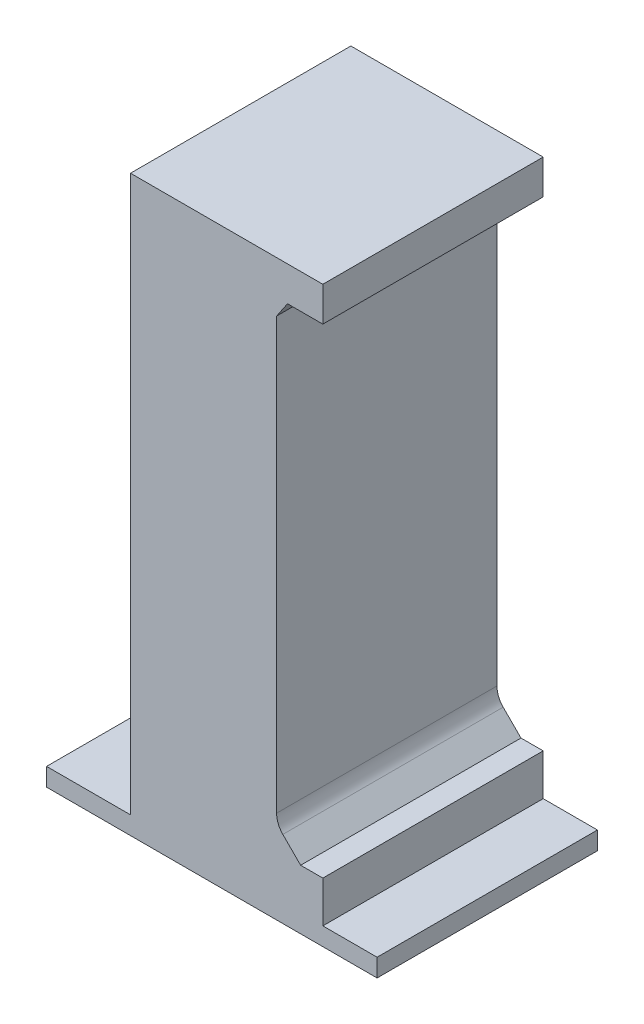
ISO-10303-21;
HEADER;
FILE_DESCRIPTION(('STEP AP214'),'2;1');
FILE_NAME('part.step','',(''),(''),'','','');
FILE_SCHEMA(('AUTOMOTIVE_DESIGN { 1 0 10303 214 1 1 1 1 }'));
ENDSEC;
DATA;
#1=APPLICATION_CONTEXT('core data for automotive mechanical design processes');
#2=APPLICATION_PROTOCOL_DEFINITION('international standard','automotive_design',2000,#1);
#3=PRODUCT_CONTEXT('',#1,'mechanical');
#4=PRODUCT('Part','Part','',(#3));
#5=PRODUCT_RELATED_PRODUCT_CATEGORY('part','',(#4));
#6=PRODUCT_DEFINITION_FORMATION('','',#4);
#7=PRODUCT_DEFINITION_CONTEXT('part definition',#1,'design');
#8=PRODUCT_DEFINITION('design','',#6,#7);
#9=PRODUCT_DEFINITION_SHAPE('','',#8);
#10=(LENGTH_UNIT() NAMED_UNIT(*) SI_UNIT(.MILLI.,.METRE.));
#11=(NAMED_UNIT(*) PLANE_ANGLE_UNIT() SI_UNIT($,.RADIAN.));
#12=(NAMED_UNIT(*) SI_UNIT($,.STERADIAN.) SOLID_ANGLE_UNIT());
#13=UNCERTAINTY_MEASURE_WITH_UNIT(LENGTH_MEASURE(1.E-05),#10,'distance_accuracy_value','');
#14=(GEOMETRIC_REPRESENTATION_CONTEXT(3) GLOBAL_UNCERTAINTY_ASSIGNED_CONTEXT((#13)) GLOBAL_UNIT_ASSIGNED_CONTEXT((#10,
#11,#12)) REPRESENTATION_CONTEXT('',''));
#15=CARTESIAN_POINT('',(0.,0.,0.));
#16=DIRECTION('',(0.,0.,1.));
#17=DIRECTION('',(1.,0.,0.));
#18=AXIS2_PLACEMENT_3D('',#15,#16,#17);
#19=CARTESIAN_POINT('',(355.677673608527,355.677673608536,500.));
#20=DIRECTION('',(-0.707106781186538,-0.707106781186557,0.));
#21=DIRECTION('',(0.707106781186557,-0.707106781186538,0.));
#22=AXIS2_PLACEMENT_3D('',#19,#20,#21);
#23=PLANE('',#22);
#24=DIRECTION('',(-0.707106781186557,0.707106781186538,0.));
#25=VECTOR('',#24,1.);
#26=CARTESIAN_POINT('',(355.677673608527,355.677673608536,0.));
#27=LINE('',#26,#25);
#28=CARTESIAN_POINT('',(576.527963911067,134.827383306002,0.));
#29=VERTEX_POINT('',#28);
#30=CARTESIAN_POINT('',(536.098133640697,175.257213576372,0.));
#31=VERTEX_POINT('',#30);
#32=EDGE_CURVE('E127',#29,#31,#27,.T.);
#33=ORIENTED_EDGE('',*,*,#32,.T.);
#34=DIRECTION('',(0.,0.,-1.));
#35=VECTOR('',#34,1.);
#36=CARTESIAN_POINT('',(536.098133640697,175.257213576372,500.));
#37=LINE('',#36,#35);
#38=CARTESIAN_POINT('',(536.098133640697,175.257213576372,500.));
#39=VERTEX_POINT('',#38);
#40=EDGE_CURVE('E11',#39,#31,#37,.T.);
#41=ORIENTED_EDGE('',*,*,#40,.F.);
#42=DIRECTION('',(-0.707106781186557,0.707106781186538,0.));
#43=VECTOR('',#42,1.);
#44=CARTESIAN_POINT('',(355.677673608527,355.677673608536,500.));
#45=LINE('',#44,#43);
#46=CARTESIAN_POINT('',(576.527963911067,134.827383306002,500.));
#47=VERTEX_POINT('',#46);
#48=EDGE_CURVE('E193',#47,#39,#45,.T.);
#49=ORIENTED_EDGE('',*,*,#48,.F.);
#50=DIRECTION('',(0.,0.,-1.));
#51=VECTOR('',#50,1.);
#52=CARTESIAN_POINT('',(576.527963911067,134.827383306002,500.));
#53=LINE('',#52,#51);
#54=EDGE_CURVE('E273',#47,#29,#53,.T.);
#55=ORIENTED_EDGE('',*,*,#54,.T.);
#56=EDGE_LOOP('',(#33,#41,#49,#55));
#57=FACE_BOUND('',#56,.T.);
#58=ADVANCED_FACE('F35',(#57),#23,.F.);
#59=CARTESIAN_POINT('',(569.887129556303,209.046209491978,500.));
#60=DIRECTION('',(0.,0.,-1.));
#61=DIRECTION('',(-1.,0.,0.));
#62=AXIS2_PLACEMENT_3D('',#59,#60,#61);
#63=CYLINDRICAL_SURFACE('',#62,47.7848562828196);
#64=CARTESIAN_POINT('',(569.887129556303,209.046209491978,0.));
#65=DIRECTION('',(0.,0.,1.));
#66=DIRECTION('',(1.,0.,0.));
#67=AXIS2_PLACEMENT_3D('',#64,#65,#66);
#68=CIRCLE('',#67,47.7848562828196);
#69=CARTESIAN_POINT('',(522.112187732539,210.019566418123,0.));
#70=VERTEX_POINT('',#69);
#71=EDGE_CURVE('E276',#31,#70,#68,.F.);
#72=ORIENTED_EDGE('',*,*,#71,.T.);
#73=DIRECTION('',(0.,0.,-1.));
#74=VECTOR('',#73,1.);
#75=CARTESIAN_POINT('',(522.112187732539,210.019566418123,500.));
#76=LINE('',#75,#74);
#77=CARTESIAN_POINT('',(522.112187732539,210.019566418123,500.));
#78=VERTEX_POINT('',#77);
#79=EDGE_CURVE('E45',#78,#70,#76,.T.);
#80=ORIENTED_EDGE('',*,*,#79,.F.);
#81=CARTESIAN_POINT('',(569.887129556303,209.046209491978,500.));
#82=DIRECTION('',(0.,0.,1.));
#83=DIRECTION('',(1.,0.,0.));
#84=AXIS2_PLACEMENT_3D('',#81,#82,#83);
#85=CIRCLE('',#84,47.7848562828196);
#86=EDGE_CURVE('E313',#39,#78,#85,.F.);
#87=ORIENTED_EDGE('',*,*,#86,.F.);
#88=ORIENTED_EDGE('',*,*,#40,.T.);
#89=EDGE_LOOP('',(#72,#80,#87,#88));
#90=FACE_BOUND('',#89,.T.);
#91=ADVANCED_FACE('F314',(#90),#63,.F.);
#92=CARTESIAN_POINT('',(522.112187732539,0.,500.));
#93=DIRECTION('',(1.,0.,0.));
#94=DIRECTION('',(0.,0.,-1.));
#95=AXIS2_PLACEMENT_3D('',#92,#93,#94);
#96=PLANE('',#95);
#97=DIRECTION('',(0.,-1.,0.));
#98=VECTOR('',#97,1.);
#99=CARTESIAN_POINT('',(522.112187732539,0.,0.));
#100=LINE('',#99,#98);
#101=CARTESIAN_POINT('',(522.112187732539,1186.98841645926,0.));
#102=VERTEX_POINT('',#101);
#103=EDGE_CURVE('E279',#102,#70,#100,.T.);
#104=ORIENTED_EDGE('',*,*,#103,.F.);
#105=DIRECTION('',(0.,0.,-1.));
#106=VECTOR('',#105,1.);
#107=CARTESIAN_POINT('',(522.112187732539,1186.98841645926,500.));
#108=LINE('',#107,#106);
#109=CARTESIAN_POINT('',(522.112187732539,1186.98841645926,500.));
#110=VERTEX_POINT('',#109);
#111=EDGE_CURVE('E342',#110,#102,#108,.T.);
#112=ORIENTED_EDGE('',*,*,#111,.F.);
#113=DIRECTION('',(0.,-1.,0.));
#114=VECTOR('',#113,1.);
#115=CARTESIAN_POINT('',(522.112187732539,0.,500.));
#116=LINE('',#115,#114);
#117=EDGE_CURVE('E317',#110,#78,#116,.T.);
#118=ORIENTED_EDGE('',*,*,#117,.T.);
#119=ORIENTED_EDGE('',*,*,#79,.T.);
#120=EDGE_LOOP('',(#104,#112,#118,#119));
#121=FACE_BOUND('',#120,.T.);
#122=ADVANCED_FACE('F345',(#121),#96,.T.);
#123=CARTESIAN_POINT('',(-192.457302623519,130.12474597394,500.));
#124=DIRECTION('',(0.828417150314277,-0.560111618398666,0.));
#125=DIRECTION('',(0.560111618398666,0.828417150314277,0.));
#126=AXIS2_PLACEMENT_3D('',#123,#124,#125);
#127=PLANE('',#126);
#128=DIRECTION('',(-0.560111618398666,-0.828417150314277,0.));
#129=VECTOR('',#128,1.);
#130=CARTESIAN_POINT('',(-192.457302623519,130.12474597394,0.));
#131=LINE('',#130,#129);
#132=CARTESIAN_POINT('',(546.743530070241,1223.41870241932,0.));
#133=VERTEX_POINT('',#132);
#134=EDGE_CURVE('E282',#133,#102,#131,.T.);
#135=ORIENTED_EDGE('',*,*,#134,.F.);
#136=DIRECTION('',(0.,0.,-1.));
#137=VECTOR('',#136,1.);
#138=CARTESIAN_POINT('',(546.743530070241,1223.41870241932,500.));
#139=LINE('',#138,#137);
#140=CARTESIAN_POINT('',(546.743530070241,1223.41870241932,500.));
#141=VERTEX_POINT('',#140);
#142=EDGE_CURVE('E329',#141,#133,#139,.T.);
#143=ORIENTED_EDGE('',*,*,#142,.F.);
#144=DIRECTION('',(-0.560111618398666,-0.828417150314277,0.));
#145=VECTOR('',#144,1.);
#146=CARTESIAN_POINT('',(-192.457302623519,130.12474597394,500.));
#147=LINE('',#146,#145);
#148=EDGE_CURVE('E319',#141,#110,#147,.T.);
#149=ORIENTED_EDGE('',*,*,#148,.T.);
#150=ORIENTED_EDGE('',*,*,#111,.T.);
#151=EDGE_LOOP('',(#135,#143,#149,#150));
#152=FACE_BOUND('',#151,.T.);
#153=ADVANCED_FACE('F347',(#152),#127,.T.);
#154=CARTESIAN_POINT('',(0.,1223.41870241932,500.));
#155=DIRECTION('',(0.,-1.,0.));
#156=DIRECTION('',(0.,0.,-1.));
#157=AXIS2_PLACEMENT_3D('',#154,#155,#156);
#158=PLANE('',#157);
#159=DIRECTION('',(-1.,0.,0.));
#160=VECTOR('',#159,1.);
#161=CARTESIAN_POINT('',(0.,1223.41870241932,0.));
#162=LINE('',#161,#160);
#163=CARTESIAN_POINT('',(626.898052251998,1223.41870241932,0.));
#164=VERTEX_POINT('',#163);
#165=EDGE_CURVE('E285',#164,#133,#162,.T.);
#166=ORIENTED_EDGE('',*,*,#165,.F.);
#167=DIRECTION('',(0.,0.,-1.));
#168=VECTOR('',#167,1.);
#169=CARTESIAN_POINT('',(626.898052251998,1223.41870241932,500.));
#170=LINE('',#169,#168);
#171=CARTESIAN_POINT('',(626.898052251998,1223.41870241932,500.));
#172=VERTEX_POINT('',#171);
#173=EDGE_CURVE('E331',#172,#164,#170,.T.);
#174=ORIENTED_EDGE('',*,*,#173,.F.);
#175=DIRECTION('',(-1.,0.,0.));
#176=VECTOR('',#175,1.);
#177=CARTESIAN_POINT('',(0.,1223.41870241932,500.));
#178=LINE('',#177,#176);
#179=EDGE_CURVE('E268',#172,#141,#178,.T.);
#180=ORIENTED_EDGE('',*,*,#179,.T.);
#181=ORIENTED_EDGE('',*,*,#142,.T.);
#182=EDGE_LOOP('',(#166,#174,#180,#181));
#183=FACE_BOUND('',#182,.T.);
#184=ADVANCED_FACE('F328',(#183),#158,.T.);
#185=CARTESIAN_POINT('',(626.898052251998,0.,500.));
#186=DIRECTION('',(1.,0.,0.));
#187=DIRECTION('',(0.,0.,-1.));
#188=AXIS2_PLACEMENT_3D('',#185,#186,#187);
#189=PLANE('',#188);
#190=DIRECTION('',(0.,-1.,0.));
#191=VECTOR('',#190,1.);
#192=CARTESIAN_POINT('',(626.898052251998,0.,0.));
#193=LINE('',#192,#191);
#194=CARTESIAN_POINT('',(626.898052251998,1301.77405160966,0.));
#195=VERTEX_POINT('',#194);
#196=EDGE_CURVE('E288',#195,#164,#193,.T.);
#197=ORIENTED_EDGE('',*,*,#196,.F.);
#198=DIRECTION('',(0.,0.,-1.));
#199=VECTOR('',#198,1.);
#200=CARTESIAN_POINT('',(626.898052251998,1301.77405160966,500.));
#201=LINE('',#200,#199);
#202=CARTESIAN_POINT('',(626.898052251998,1301.77405160966,500.));
#203=VERTEX_POINT('',#202);
#204=EDGE_CURVE('E337',#203,#195,#201,.T.);
#205=ORIENTED_EDGE('',*,*,#204,.F.);
#206=DIRECTION('',(0.,-1.,0.));
#207=VECTOR('',#206,1.);
#208=CARTESIAN_POINT('',(626.898052251998,0.,500.));
#209=LINE('',#208,#207);
#210=EDGE_CURVE('E261',#203,#172,#209,.T.);
#211=ORIENTED_EDGE('',*,*,#210,.T.);
#212=ORIENTED_EDGE('',*,*,#173,.T.);
#213=EDGE_LOOP('',(#197,#205,#211,#212));
#214=FACE_BOUND('',#213,.T.);
#215=ADVANCED_FACE('F336',(#214),#189,.T.);
#216=CARTESIAN_POINT('',(0.,1301.77405160966,500.));
#217=DIRECTION('',(0.,1.,0.));
#218=DIRECTION('',(0.,0.,1.));
#219=AXIS2_PLACEMENT_3D('',#216,#217,#218);
#220=PLANE('',#219);
#221=DIRECTION('',(1.,0.,0.));
#222=VECTOR('',#221,1.);
#223=CARTESIAN_POINT('',(0.,1301.77405160966,0.));
#224=LINE('',#223,#222);
#225=CARTESIAN_POINT('',(190.474219633678,1301.77405160966,0.));
#226=VERTEX_POINT('',#225);
#227=EDGE_CURVE('E233',#226,#195,#224,.T.);
#228=ORIENTED_EDGE('',*,*,#227,.F.);
#229=DIRECTION('',(0.,0.,-1.));
#230=VECTOR('',#229,1.);
#231=CARTESIAN_POINT('',(190.474219633678,1301.77405160966,500.));
#232=LINE('',#231,#230);
#233=CARTESIAN_POINT('',(190.474219633678,1301.77405160966,500.));
#234=VERTEX_POINT('',#233);
#235=EDGE_CURVE('E251',#234,#226,#232,.T.);
#236=ORIENTED_EDGE('',*,*,#235,.F.);
#237=DIRECTION('',(1.,0.,0.));
#238=VECTOR('',#237,1.);
#239=CARTESIAN_POINT('',(0.,1301.77405160966,500.));
#240=LINE('',#239,#238);
#241=EDGE_CURVE('E256',#234,#203,#240,.T.);
#242=ORIENTED_EDGE('',*,*,#241,.T.);
#243=ORIENTED_EDGE('',*,*,#204,.T.);
#244=EDGE_LOOP('',(#228,#236,#242,#243));
#245=FACE_BOUND('',#244,.T.);
#246=ADVANCED_FACE('F389',(#245),#220,.T.);
#247=CARTESIAN_POINT('',(190.474219633678,0.,500.));
#248=DIRECTION('',(-1.,0.,0.));
#249=DIRECTION('',(0.,0.,1.));
#250=AXIS2_PLACEMENT_3D('',#247,#248,#249);
#251=PLANE('',#250);
#252=DIRECTION('',(0.,1.,0.));
#253=VECTOR('',#252,1.);
#254=CARTESIAN_POINT('',(190.474219633678,0.,0.));
#255=LINE('',#254,#253);
#256=CARTESIAN_POINT('',(190.474219633678,40.878221652433,0.));
#257=VERTEX_POINT('',#256);
#258=EDGE_CURVE('E231',#257,#226,#255,.T.);
#259=ORIENTED_EDGE('',*,*,#258,.F.);
#260=DIRECTION('',(0.,0.,-1.));
#261=VECTOR('',#260,1.);
#262=CARTESIAN_POINT('',(190.474219633678,40.878221652433,500.));
#263=LINE('',#262,#261);
#264=CARTESIAN_POINT('',(190.474219633678,40.878221652433,500.));
#265=VERTEX_POINT('',#264);
#266=EDGE_CURVE('E144',#265,#257,#263,.T.);
#267=ORIENTED_EDGE('',*,*,#266,.F.);
#268=DIRECTION('',(0.,1.,0.));
#269=VECTOR('',#268,1.);
#270=CARTESIAN_POINT('',(190.474219633678,0.,500.));
#271=LINE('',#270,#269);
#272=EDGE_CURVE('E240',#265,#234,#271,.T.);
#273=ORIENTED_EDGE('',*,*,#272,.T.);
#274=ORIENTED_EDGE('',*,*,#235,.T.);
#275=EDGE_LOOP('',(#259,#267,#273,#274));
#276=FACE_BOUND('',#275,.T.);
#277=ADVANCED_FACE('F397',(#276),#251,.T.);
#278=CARTESIAN_POINT('',(626.898052251998,0.,500.));
#279=DIRECTION('',(-1.,0.,0.));
#280=DIRECTION('',(0.,0.,1.));
#281=AXIS2_PLACEMENT_3D('',#278,#279,#280);
#282=PLANE('',#281);
#283=DIRECTION('',(0.,1.,0.));
#284=VECTOR('',#283,1.);
#285=CARTESIAN_POINT('',(626.898052251998,0.,0.));
#286=LINE('',#285,#284);
#287=CARTESIAN_POINT('',(626.898052251998,40.878221652433,0.));
#288=VERTEX_POINT('',#287);
#289=CARTESIAN_POINT('',(626.898052251998,134.827383306002,0.));
#290=VERTEX_POINT('',#289);
#291=EDGE_CURVE('E226',#288,#290,#286,.T.);
#292=ORIENTED_EDGE('',*,*,#291,.T.);
#293=DIRECTION('',(0.,0.,-1.));
#294=VECTOR('',#293,1.);
#295=CARTESIAN_POINT('',(626.898052251998,134.827383306002,500.));
#296=LINE('',#295,#294);
#297=CARTESIAN_POINT('',(626.898052251998,134.827383306002,500.));
#298=VERTEX_POINT('',#297);
#299=EDGE_CURVE('E243',#298,#290,#296,.T.);
#300=ORIENTED_EDGE('',*,*,#299,.F.);
#301=DIRECTION('',(0.,1.,0.));
#302=VECTOR('',#301,1.);
#303=CARTESIAN_POINT('',(626.898052251998,0.,500.));
#304=LINE('',#303,#302);
#305=CARTESIAN_POINT('',(626.898052251998,40.878221652433,500.));
#306=VERTEX_POINT('',#305);
#307=EDGE_CURVE('E238',#306,#298,#304,.T.);
#308=ORIENTED_EDGE('',*,*,#307,.F.);
#309=DIRECTION('',(0.,0.,-1.));
#310=VECTOR('',#309,1.);
#311=CARTESIAN_POINT('',(626.898052251998,40.878221652433,500.));
#312=LINE('',#311,#310);
#313=EDGE_CURVE('E187',#306,#288,#312,.T.);
#314=ORIENTED_EDGE('',*,*,#313,.T.);
#315=EDGE_LOOP('',(#292,#300,#308,#314));
#316=FACE_BOUND('',#315,.T.);
#317=ADVANCED_FACE('F204',(#316),#282,.F.);
#318=CARTESIAN_POINT('',(0.,134.827383306002,500.));
#319=DIRECTION('',(0.,-1.,0.));
#320=DIRECTION('',(0.,0.,-1.));
#321=AXIS2_PLACEMENT_3D('',#318,#319,#320);
#322=PLANE('',#321);
#323=DIRECTION('',(-1.,0.,0.));
#324=VECTOR('',#323,1.);
#325=CARTESIAN_POINT('',(0.,134.827383306002,0.));
#326=LINE('',#325,#324);
#327=EDGE_CURVE('E227',#290,#29,#326,.T.);
#328=ORIENTED_EDGE('',*,*,#327,.T.);
#329=ORIENTED_EDGE('',*,*,#54,.F.);
#330=DIRECTION('',(-1.,0.,0.));
#331=VECTOR('',#330,1.);
#332=CARTESIAN_POINT('',(0.,134.827383306002,500.));
#333=LINE('',#332,#331);
#334=EDGE_CURVE('E54',#298,#47,#333,.T.);
#335=ORIENTED_EDGE('',*,*,#334,.F.);
#336=ORIENTED_EDGE('',*,*,#299,.T.);
#337=EDGE_LOOP('',(#328,#329,#335,#336));
#338=FACE_BOUND('',#337,.T.);
#339=ADVANCED_FACE('F196',(#338),#322,.F.);
#340=CARTESIAN_POINT('',(0.,0.,500.));
#341=DIRECTION('',(0.,0.,1.));
#342=DIRECTION('',(1.,0.,0.));
#343=AXIS2_PLACEMENT_3D('',#340,#341,#342);
#344=PLANE('',#343);
#345=ORIENTED_EDGE('',*,*,#48,.T.);
#346=ORIENTED_EDGE('',*,*,#86,.T.);
#347=ORIENTED_EDGE('',*,*,#117,.F.);
#348=ORIENTED_EDGE('',*,*,#148,.F.);
#349=ORIENTED_EDGE('',*,*,#179,.F.);
#350=ORIENTED_EDGE('',*,*,#210,.F.);
#351=ORIENTED_EDGE('',*,*,#241,.F.);
#352=ORIENTED_EDGE('',*,*,#272,.F.);
#353=DIRECTION('',(1.,0.,0.));
#354=VECTOR('',#353,1.);
#355=CARTESIAN_POINT('',(0.,40.878221652433,500.));
#356=LINE('',#355,#354);
#357=CARTESIAN_POINT('',(0.,40.878221652433,500.));
#358=VERTEX_POINT('',#357);
#359=EDGE_CURVE('E174',#358,#265,#356,.T.);
#360=ORIENTED_EDGE('',*,*,#359,.F.);
#361=DIRECTION('',(0.,-1.,0.));
#362=VECTOR('',#361,1.);
#363=CARTESIAN_POINT('',(0.,40.878221652433,500.));
#364=LINE('',#363,#362);
#365=CARTESIAN_POINT('',(0.,0.,500.));
#366=VERTEX_POINT('',#365);
#367=EDGE_CURVE('E122',#358,#366,#364,.T.);
#368=ORIENTED_EDGE('',*,*,#367,.T.);
#369=DIRECTION('',(1.,0.,0.));
#370=VECTOR('',#369,1.);
#371=CARTESIAN_POINT('',(0.,0.,500.));
#372=LINE('',#371,#370);
#373=CARTESIAN_POINT('',(750.,0.,500.));
#374=VERTEX_POINT('',#373);
#375=EDGE_CURVE('E170',#366,#374,#372,.T.);
#376=ORIENTED_EDGE('',*,*,#375,.T.);
#377=DIRECTION('',(0.,-1.,0.));
#378=VECTOR('',#377,1.);
#379=CARTESIAN_POINT('',(750.,40.878221652433,500.));
#380=LINE('',#379,#378);
#381=CARTESIAN_POINT('',(750.,40.878221652433,500.));
#382=VERTEX_POINT('',#381);
#383=EDGE_CURVE('E171',#382,#374,#380,.T.);
#384=ORIENTED_EDGE('',*,*,#383,.F.);
#385=EDGE_CURVE('E141',#306,#382,#356,.T.);
#386=ORIENTED_EDGE('',*,*,#385,.F.);
#387=ORIENTED_EDGE('',*,*,#307,.T.);
#388=ORIENTED_EDGE('',*,*,#334,.T.);
#389=EDGE_LOOP('',(#345,#346,#347,#348,#349,#350,#351,#352,#360,#368,#376,#384,#386,#387,#388));
#390=FACE_BOUND('',#389,.T.);
#391=ADVANCED_FACE('F190',(#390),#344,.T.);
#392=CARTESIAN_POINT('',(0.,0.,0.));
#393=DIRECTION('',(0.,0.,1.));
#394=DIRECTION('',(1.,0.,0.));
#395=AXIS2_PLACEMENT_3D('',#392,#393,#394);
#396=PLANE('',#395);
#397=ORIENTED_EDGE('',*,*,#32,.F.);
#398=ORIENTED_EDGE('',*,*,#327,.F.);
#399=ORIENTED_EDGE('',*,*,#291,.F.);
#400=DIRECTION('',(1.,0.,0.));
#401=VECTOR('',#400,1.);
#402=CARTESIAN_POINT('',(0.,40.878221652433,0.));
#403=LINE('',#402,#401);
#404=CARTESIAN_POINT('',(750.,40.878221652433,0.));
#405=VERTEX_POINT('',#404);
#406=EDGE_CURVE('E146',#288,#405,#403,.T.);
#407=ORIENTED_EDGE('',*,*,#406,.T.);
#408=DIRECTION('',(0.,-1.,0.));
#409=VECTOR('',#408,1.);
#410=CARTESIAN_POINT('',(750.,40.878221652433,0.));
#411=LINE('',#410,#409);
#412=CARTESIAN_POINT('',(750.,0.,0.));
#413=VERTEX_POINT('',#412);
#414=EDGE_CURVE('E145',#405,#413,#411,.T.);
#415=ORIENTED_EDGE('',*,*,#414,.T.);
#416=DIRECTION('',(1.,0.,0.));
#417=VECTOR('',#416,1.);
#418=CARTESIAN_POINT('',(0.,0.,0.));
#419=LINE('',#418,#417);
#420=CARTESIAN_POINT('',(0.,0.,0.));
#421=VERTEX_POINT('',#420);
#422=EDGE_CURVE('E140',#421,#413,#419,.T.);
#423=ORIENTED_EDGE('',*,*,#422,.F.);
#424=DIRECTION('',(0.,-1.,0.));
#425=VECTOR('',#424,1.);
#426=CARTESIAN_POINT('',(0.,40.878221652433,0.));
#427=LINE('',#426,#425);
#428=CARTESIAN_POINT('',(0.,40.878221652433,0.));
#429=VERTEX_POINT('',#428);
#430=EDGE_CURVE('E117',#429,#421,#427,.T.);
#431=ORIENTED_EDGE('',*,*,#430,.F.);
#432=EDGE_CURVE('E136',#429,#257,#403,.T.);
#433=ORIENTED_EDGE('',*,*,#432,.T.);
#434=ORIENTED_EDGE('',*,*,#258,.T.);
#435=ORIENTED_EDGE('',*,*,#227,.T.);
#436=ORIENTED_EDGE('',*,*,#196,.T.);
#437=ORIENTED_EDGE('',*,*,#165,.T.);
#438=ORIENTED_EDGE('',*,*,#134,.T.);
#439=ORIENTED_EDGE('',*,*,#103,.T.);
#440=ORIENTED_EDGE('',*,*,#71,.F.);
#441=EDGE_LOOP('',(#397,#398,#399,#407,#415,#423,#431,#433,#434,#435,#436,#437,#438,#439,#440));
#442=FACE_BOUND('',#441,.T.);
#443=ADVANCED_FACE('F134',(#442),#396,.F.);
#444=CARTESIAN_POINT('',(0.,0.,500.));
#445=DIRECTION('',(0.,1.,0.));
#446=DIRECTION('',(0.,0.,1.));
#447=AXIS2_PLACEMENT_3D('',#444,#445,#446);
#448=PLANE('',#447);
#449=ORIENTED_EDGE('',*,*,#422,.T.);
#450=DIRECTION('',(0.,0.,-1.));
#451=VECTOR('',#450,1.);
#452=CARTESIAN_POINT('',(750.,0.,500.));
#453=LINE('',#452,#451);
#454=EDGE_CURVE('E161',#374,#413,#453,.T.);
#455=ORIENTED_EDGE('',*,*,#454,.F.);
#456=ORIENTED_EDGE('',*,*,#375,.F.);
#457=DIRECTION('',(0.,0.,-1.));
#458=VECTOR('',#457,1.);
#459=CARTESIAN_POINT('',(0.,0.,500.));
#460=LINE('',#459,#458);
#461=EDGE_CURVE('E128',#366,#421,#460,.T.);
#462=ORIENTED_EDGE('',*,*,#461,.T.);
#463=EDGE_LOOP('',(#449,#455,#456,#462));
#464=FACE_BOUND('',#463,.T.);
#465=ADVANCED_FACE('F202',(#464),#448,.F.);
#466=CARTESIAN_POINT('',(750.,40.878221652433,500.));
#467=DIRECTION('',(1.,0.,0.));
#468=DIRECTION('',(0.,0.,-1.));
#469=AXIS2_PLACEMENT_3D('',#466,#467,#468);
#470=PLANE('',#469);
#471=ORIENTED_EDGE('',*,*,#414,.F.);
#472=DIRECTION('',(0.,0.,-1.));
#473=VECTOR('',#472,1.);
#474=CARTESIAN_POINT('',(750.,40.878221652433,500.));
#475=LINE('',#474,#473);
#476=EDGE_CURVE('E152',#382,#405,#475,.T.);
#477=ORIENTED_EDGE('',*,*,#476,.F.);
#478=ORIENTED_EDGE('',*,*,#383,.T.);
#479=ORIENTED_EDGE('',*,*,#454,.T.);
#480=EDGE_LOOP('',(#471,#477,#478,#479));
#481=FACE_BOUND('',#480,.T.);
#482=ADVANCED_FACE('F189',(#481),#470,.T.);
#483=CARTESIAN_POINT('',(0.,40.878221652433,500.));
#484=DIRECTION('',(1.,0.,0.));
#485=DIRECTION('',(0.,0.,-1.));
#486=AXIS2_PLACEMENT_3D('',#483,#484,#485);
#487=PLANE('',#486);
#488=ORIENTED_EDGE('',*,*,#430,.T.);
#489=ORIENTED_EDGE('',*,*,#461,.F.);
#490=ORIENTED_EDGE('',*,*,#367,.F.);
#491=DIRECTION('',(0.,0.,-1.));
#492=VECTOR('',#491,1.);
#493=CARTESIAN_POINT('',(0.,40.878221652433,500.));
#494=LINE('',#493,#492);
#495=EDGE_CURVE('E120',#358,#429,#494,.T.);
#496=ORIENTED_EDGE('',*,*,#495,.T.);
#497=EDGE_LOOP('',(#488,#489,#490,#496));
#498=FACE_BOUND('',#497,.T.);
#499=ADVANCED_FACE('F121',(#498),#487,.F.);
#500=CARTESIAN_POINT('',(0.,40.878221652433,500.));
#501=DIRECTION('',(0.,1.,0.));
#502=DIRECTION('',(0.,0.,1.));
#503=AXIS2_PLACEMENT_3D('',#500,#501,#502);
#504=PLANE('',#503);
#505=ORIENTED_EDGE('',*,*,#359,.T.);
#506=ORIENTED_EDGE('',*,*,#266,.T.);
#507=ORIENTED_EDGE('',*,*,#432,.F.);
#508=ORIENTED_EDGE('',*,*,#495,.F.);
#509=EDGE_LOOP('',(#505,#506,#507,#508));
#510=FACE_BOUND('',#509,.T.);
#511=ADVANCED_FACE('F37',(#510),#504,.T.);
#512=ORIENTED_EDGE('',*,*,#313,.F.);
#513=ORIENTED_EDGE('',*,*,#385,.T.);
#514=ORIENTED_EDGE('',*,*,#476,.T.);
#515=ORIENTED_EDGE('',*,*,#406,.F.);
#516=EDGE_LOOP('',(#512,#513,#514,#515));
#517=FACE_BOUND('',#516,.T.);
#518=ADVANCED_FACE('F186',(#517),#504,.T.);
#519=CLOSED_SHELL('',(#58,#91,#122,#153,#184,#215,#246,#277,#317,#339,#391,#443,#465,#482,#499,
#511,#518));
#520=MANIFOLD_SOLID_BREP('B2',#519);
#521=ADVANCED_BREP_SHAPE_REPRESENTATION('',(#18,#520),#14);
#522=SHAPE_DEFINITION_REPRESENTATION(#9,#521);
ENDSEC;
END-ISO-10303-21;
